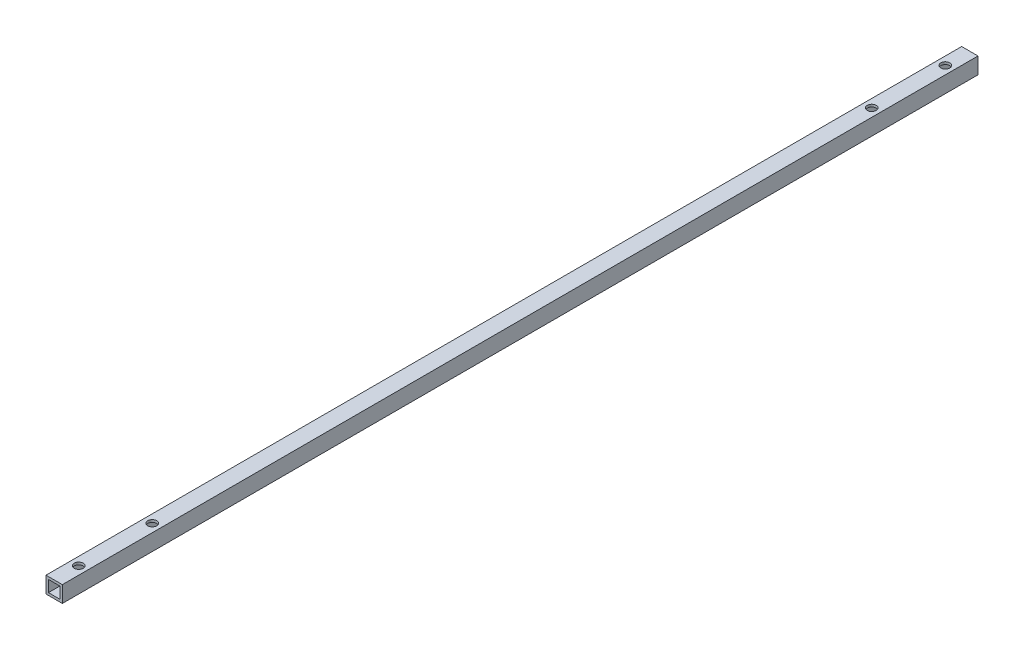
ISO-10303-21;
HEADER;
FILE_DESCRIPTION(('STEP AP214'),'2;1');
FILE_NAME('part.step','',(''),(''),'','','');
FILE_SCHEMA(('AUTOMOTIVE_DESIGN { 1 0 10303 214 1 1 1 1 }'));
ENDSEC;
DATA;
#1=APPLICATION_CONTEXT('core data for automotive mechanical design processes');
#2=APPLICATION_PROTOCOL_DEFINITION('international standard','automotive_design',2000,#1);
#3=PRODUCT_CONTEXT('',#1,'mechanical');
#4=PRODUCT('Part','Part','',(#3));
#5=PRODUCT_RELATED_PRODUCT_CATEGORY('part','',(#4));
#6=PRODUCT_DEFINITION_FORMATION('','',#4);
#7=PRODUCT_DEFINITION_CONTEXT('part definition',#1,'design');
#8=PRODUCT_DEFINITION('design','',#6,#7);
#9=PRODUCT_DEFINITION_SHAPE('','',#8);
#10=(LENGTH_UNIT() NAMED_UNIT(*) SI_UNIT(.MILLI.,.METRE.));
#11=(NAMED_UNIT(*) PLANE_ANGLE_UNIT() SI_UNIT($,.RADIAN.));
#12=(NAMED_UNIT(*) SI_UNIT($,.STERADIAN.) SOLID_ANGLE_UNIT());
#13=UNCERTAINTY_MEASURE_WITH_UNIT(LENGTH_MEASURE(1.E-05),#10,'distance_accuracy_value','');
#14=(GEOMETRIC_REPRESENTATION_CONTEXT(3) GLOBAL_UNCERTAINTY_ASSIGNED_CONTEXT((#13)) GLOBAL_UNIT_ASSIGNED_CONTEXT((#10,
#11,#12)) REPRESENTATION_CONTEXT('',''));
#15=CARTESIAN_POINT('',(0.,0.,0.));
#16=DIRECTION('',(0.,0.,1.));
#17=DIRECTION('',(1.,0.,0.));
#18=AXIS2_PLACEMENT_3D('',#15,#16,#17);
#19=CARTESIAN_POINT('',(-5.,-5.,-280.));
#20=DIRECTION('',(-1.,0.,0.));
#21=DIRECTION('',(0.,0.,1.));
#22=AXIS2_PLACEMENT_3D('',#19,#20,#21);
#23=PLANE('',#22);
#24=DIRECTION('',(0.,-1.,0.));
#25=VECTOR('',#24,1.);
#26=CARTESIAN_POINT('',(-5.,-5.,280.));
#27=LINE('',#26,#25);
#28=CARTESIAN_POINT('',(-5.,5.,280.));
#29=VERTEX_POINT('',#28);
#30=CARTESIAN_POINT('',(-5.,-5.,280.));
#31=VERTEX_POINT('',#30);
#32=EDGE_CURVE('E133',#29,#31,#27,.T.);
#33=ORIENTED_EDGE('',*,*,#32,.F.);
#34=DIRECTION('',(0.,0.,1.));
#35=VECTOR('',#34,1.);
#36=CARTESIAN_POINT('',(-5.,5.,-280.));
#37=LINE('',#36,#35);
#38=CARTESIAN_POINT('',(-5.,5.,-280.));
#39=VERTEX_POINT('',#38);
#40=EDGE_CURVE('E11',#39,#29,#37,.T.);
#41=ORIENTED_EDGE('',*,*,#40,.F.);
#42=DIRECTION('',(0.,-1.,0.));
#43=VECTOR('',#42,1.);
#44=CARTESIAN_POINT('',(-5.,-5.,-280.));
#45=LINE('',#44,#43);
#46=CARTESIAN_POINT('',(-5.,-5.,-280.));
#47=VERTEX_POINT('',#46);
#48=EDGE_CURVE('E137',#39,#47,#45,.T.);
#49=ORIENTED_EDGE('',*,*,#48,.T.);
#50=DIRECTION('',(0.,0.,1.));
#51=VECTOR('',#50,1.);
#52=CARTESIAN_POINT('',(-5.,-5.,-280.));
#53=LINE('',#52,#51);
#54=EDGE_CURVE('E150',#47,#31,#53,.T.);
#55=ORIENTED_EDGE('',*,*,#54,.T.);
#56=EDGE_LOOP('',(#33,#41,#49,#55));
#57=FACE_BOUND('',#56,.T.);
#58=ADVANCED_FACE('F32',(#57),#23,.T.);
#59=CARTESIAN_POINT('',(5.,5.,-280.));
#60=DIRECTION('',(0.,1.,0.));
#61=DIRECTION('',(0.,0.,1.));
#62=AXIS2_PLACEMENT_3D('',#59,#60,#61);
#63=PLANE('',#62);
#64=CARTESIAN_POINT('',(0.,5.,-220.));
#65=DIRECTION('',(0.,1.,0.));
#66=DIRECTION('',(0.,0.,1.));
#67=AXIS2_PLACEMENT_3D('',#64,#65,#66);
#68=CIRCLE('',#67,2.75);
#69=CARTESIAN_POINT('',(0.,5.,-217.25));
#70=VERTEX_POINT('',#69);
#71=EDGE_CURVE('E177',#70,#70,#68,.T.);
#72=ORIENTED_EDGE('',*,*,#71,.F.);
#73=EDGE_LOOP('',(#72));
#74=FACE_BOUND('',#73,.T.);
#75=CARTESIAN_POINT('',(0.,5.,220.));
#76=DIRECTION('',(0.,1.,0.));
#77=DIRECTION('',(0.,0.,1.));
#78=AXIS2_PLACEMENT_3D('',#75,#76,#77);
#79=CIRCLE('',#78,2.75);
#80=CARTESIAN_POINT('',(0.,5.,222.75));
#81=VERTEX_POINT('',#80);
#82=EDGE_CURVE('E173',#81,#81,#79,.T.);
#83=ORIENTED_EDGE('',*,*,#82,.F.);
#84=EDGE_LOOP('',(#83));
#85=FACE_BOUND('',#84,.T.);
#86=CARTESIAN_POINT('',(0.,5.,-265.));
#87=DIRECTION('',(0.,1.,0.));
#88=DIRECTION('',(0.,0.,1.));
#89=AXIS2_PLACEMENT_3D('',#86,#87,#88);
#90=CIRCLE('',#89,2.75);
#91=CARTESIAN_POINT('',(0.,5.,-262.25));
#92=VERTEX_POINT('',#91);
#93=EDGE_CURVE('E169',#92,#92,#90,.T.);
#94=ORIENTED_EDGE('',*,*,#93,.F.);
#95=EDGE_LOOP('',(#94));
#96=FACE_BOUND('',#95,.T.);
#97=CARTESIAN_POINT('',(0.,5.,265.));
#98=DIRECTION('',(0.,1.,0.));
#99=DIRECTION('',(0.,0.,1.));
#100=AXIS2_PLACEMENT_3D('',#97,#98,#99);
#101=CIRCLE('',#100,2.75);
#102=CARTESIAN_POINT('',(0.,5.,267.75));
#103=VERTEX_POINT('',#102);
#104=EDGE_CURVE('E121',#103,#103,#101,.T.);
#105=ORIENTED_EDGE('',*,*,#104,.F.);
#106=EDGE_LOOP('',(#105));
#107=FACE_BOUND('',#106,.T.);
#108=DIRECTION('',(-1.,0.,0.));
#109=VECTOR('',#108,1.);
#110=CARTESIAN_POINT('',(5.,5.,280.));
#111=LINE('',#110,#109);
#112=CARTESIAN_POINT('',(5.,5.,280.));
#113=VERTEX_POINT('',#112);
#114=EDGE_CURVE('E141',#113,#29,#111,.T.);
#115=ORIENTED_EDGE('',*,*,#114,.F.);
#116=DIRECTION('',(0.,0.,1.));
#117=VECTOR('',#116,1.);
#118=CARTESIAN_POINT('',(5.,5.,-280.));
#119=LINE('',#118,#117);
#120=CARTESIAN_POINT('',(5.,5.,-280.));
#121=VERTEX_POINT('',#120);
#122=EDGE_CURVE('E40',#121,#113,#119,.T.);
#123=ORIENTED_EDGE('',*,*,#122,.F.);
#124=DIRECTION('',(-1.,0.,0.));
#125=VECTOR('',#124,1.);
#126=CARTESIAN_POINT('',(5.,5.,-280.));
#127=LINE('',#126,#125);
#128=EDGE_CURVE('E147',#121,#39,#127,.T.);
#129=ORIENTED_EDGE('',*,*,#128,.T.);
#130=ORIENTED_EDGE('',*,*,#40,.T.);
#131=EDGE_LOOP('',(#115,#123,#129,#130));
#132=FACE_BOUND('',#131,.T.);
#133=ADVANCED_FACE('F215',(#74,#85,#96,#107,#132),#63,.T.);
#134=CARTESIAN_POINT('',(5.,-5.,-280.));
#135=DIRECTION('',(1.,0.,0.));
#136=DIRECTION('',(0.,0.,-1.));
#137=AXIS2_PLACEMENT_3D('',#134,#135,#136);
#138=PLANE('',#137);
#139=DIRECTION('',(0.,1.,0.));
#140=VECTOR('',#139,1.);
#141=CARTESIAN_POINT('',(5.,-5.,280.));
#142=LINE('',#141,#140);
#143=CARTESIAN_POINT('',(5.,-5.,280.));
#144=VERTEX_POINT('',#143);
#145=EDGE_CURVE('E156',#144,#113,#142,.T.);
#146=ORIENTED_EDGE('',*,*,#145,.F.);
#147=DIRECTION('',(0.,0.,1.));
#148=VECTOR('',#147,1.);
#149=CARTESIAN_POINT('',(5.,-5.,-280.));
#150=LINE('',#149,#148);
#151=CARTESIAN_POINT('',(5.,-5.,-280.));
#152=VERTEX_POINT('',#151);
#153=EDGE_CURVE('E162',#152,#144,#150,.T.);
#154=ORIENTED_EDGE('',*,*,#153,.F.);
#155=DIRECTION('',(0.,1.,0.));
#156=VECTOR('',#155,1.);
#157=CARTESIAN_POINT('',(5.,-5.,-280.));
#158=LINE('',#157,#156);
#159=EDGE_CURVE('E144',#152,#121,#158,.T.);
#160=ORIENTED_EDGE('',*,*,#159,.T.);
#161=ORIENTED_EDGE('',*,*,#122,.T.);
#162=EDGE_LOOP('',(#146,#154,#160,#161));
#163=FACE_BOUND('',#162,.T.);
#164=ADVANCED_FACE('F218',(#163),#138,.T.);
#165=CARTESIAN_POINT('',(5.,-5.,-280.));
#166=DIRECTION('',(0.,-1.,0.));
#167=DIRECTION('',(1.,0.,0.));
#168=AXIS2_PLACEMENT_3D('',#165,#166,#167);
#169=PLANE('',#168);
#170=CARTESIAN_POINT('',(0.,-5.,-220.));
#171=DIRECTION('',(0.,-1.,0.));
#172=DIRECTION('',(1.,0.,0.));
#173=AXIS2_PLACEMENT_3D('',#170,#171,#172);
#174=CIRCLE('',#173,2.75);
#175=CARTESIAN_POINT('',(2.75,-5.,-220.));
#176=VERTEX_POINT('',#175);
#177=EDGE_CURVE('E184',#176,#176,#174,.T.);
#178=ORIENTED_EDGE('',*,*,#177,.F.);
#179=EDGE_LOOP('',(#178));
#180=FACE_BOUND('',#179,.T.);
#181=CARTESIAN_POINT('',(0.,-5.,220.));
#182=DIRECTION('',(0.,-1.,0.));
#183=DIRECTION('',(1.,0.,0.));
#184=AXIS2_PLACEMENT_3D('',#181,#182,#183);
#185=CIRCLE('',#184,2.75);
#186=CARTESIAN_POINT('',(2.75,-5.,220.));
#187=VERTEX_POINT('',#186);
#188=EDGE_CURVE('E181',#187,#187,#185,.T.);
#189=ORIENTED_EDGE('',*,*,#188,.F.);
#190=EDGE_LOOP('',(#189));
#191=FACE_BOUND('',#190,.T.);
#192=CARTESIAN_POINT('',(0.,-5.,-265.));
#193=DIRECTION('',(0.,-1.,0.));
#194=DIRECTION('',(1.,0.,0.));
#195=AXIS2_PLACEMENT_3D('',#192,#193,#194);
#196=CIRCLE('',#195,2.75);
#197=CARTESIAN_POINT('',(2.75,-5.,-265.));
#198=VERTEX_POINT('',#197);
#199=EDGE_CURVE('E199',#198,#198,#196,.T.);
#200=ORIENTED_EDGE('',*,*,#199,.F.);
#201=EDGE_LOOP('',(#200));
#202=FACE_BOUND('',#201,.T.);
#203=CARTESIAN_POINT('',(0.,-5.,265.));
#204=DIRECTION('',(0.,-1.,0.));
#205=DIRECTION('',(1.,0.,0.));
#206=AXIS2_PLACEMENT_3D('',#203,#204,#205);
#207=CIRCLE('',#206,2.75);
#208=CARTESIAN_POINT('',(2.75,-5.,265.));
#209=VERTEX_POINT('',#208);
#210=EDGE_CURVE('E205',#209,#209,#207,.T.);
#211=ORIENTED_EDGE('',*,*,#210,.F.);
#212=EDGE_LOOP('',(#211));
#213=FACE_BOUND('',#212,.T.);
#214=DIRECTION('',(1.,0.,0.));
#215=VECTOR('',#214,1.);
#216=CARTESIAN_POINT('',(5.,-5.,280.));
#217=LINE('',#216,#215);
#218=EDGE_CURVE('E153',#31,#144,#217,.T.);
#219=ORIENTED_EDGE('',*,*,#218,.F.);
#220=ORIENTED_EDGE('',*,*,#54,.F.);
#221=DIRECTION('',(1.,0.,0.));
#222=VECTOR('',#221,1.);
#223=CARTESIAN_POINT('',(5.,-5.,-280.));
#224=LINE('',#223,#222);
#225=EDGE_CURVE('E140',#47,#152,#224,.T.);
#226=ORIENTED_EDGE('',*,*,#225,.T.);
#227=ORIENTED_EDGE('',*,*,#153,.T.);
#228=EDGE_LOOP('',(#219,#220,#226,#227));
#229=FACE_BOUND('',#228,.T.);
#230=ADVANCED_FACE('F234',(#180,#191,#202,#213,#229),#169,.T.);
#231=CARTESIAN_POINT('',(-5.,5.,-280.));
#232=DIRECTION('',(0.,0.,1.));
#233=DIRECTION('',(1.,0.,0.));
#234=AXIS2_PLACEMENT_3D('',#231,#232,#233);
#235=PLANE('',#234);
#236=DIRECTION('',(-1.,0.,0.));
#237=VECTOR('',#236,1.);
#238=CARTESIAN_POINT('',(3.5,3.5,-280.));
#239=LINE('',#238,#237);
#240=CARTESIAN_POINT('',(3.5,3.5,-280.));
#241=VERTEX_POINT('',#240);
#242=CARTESIAN_POINT('',(-3.5,3.5,-280.));
#243=VERTEX_POINT('',#242);
#244=EDGE_CURVE('E105',#241,#243,#239,.T.);
#245=ORIENTED_EDGE('',*,*,#244,.T.);
#246=DIRECTION('',(0.,-1.,0.));
#247=VECTOR('',#246,1.);
#248=CARTESIAN_POINT('',(-3.5,-3.5,-280.));
#249=LINE('',#248,#247);
#250=CARTESIAN_POINT('',(-3.5,-3.5,-280.));
#251=VERTEX_POINT('',#250);
#252=EDGE_CURVE('E99',#243,#251,#249,.T.);
#253=ORIENTED_EDGE('',*,*,#252,.T.);
#254=DIRECTION('',(1.,0.,0.));
#255=VECTOR('',#254,1.);
#256=CARTESIAN_POINT('',(3.5,-3.5,-280.));
#257=LINE('',#256,#255);
#258=CARTESIAN_POINT('',(3.5,-3.5,-280.));
#259=VERTEX_POINT('',#258);
#260=EDGE_CURVE('E108',#251,#259,#257,.T.);
#261=ORIENTED_EDGE('',*,*,#260,.T.);
#262=DIRECTION('',(0.,1.,0.));
#263=VECTOR('',#262,1.);
#264=CARTESIAN_POINT('',(3.5,-3.5,-280.));
#265=LINE('',#264,#263);
#266=EDGE_CURVE('E48',#259,#241,#265,.T.);
#267=ORIENTED_EDGE('',*,*,#266,.T.);
#268=EDGE_LOOP('',(#245,#253,#261,#267));
#269=FACE_BOUND('',#268,.T.);
#270=ORIENTED_EDGE('',*,*,#48,.F.);
#271=ORIENTED_EDGE('',*,*,#128,.F.);
#272=ORIENTED_EDGE('',*,*,#159,.F.);
#273=ORIENTED_EDGE('',*,*,#225,.F.);
#274=EDGE_LOOP('',(#270,#271,#272,#273));
#275=FACE_BOUND('',#274,.T.);
#276=ADVANCED_FACE('F112',(#269,#275),#235,.F.);
#277=CARTESIAN_POINT('',(-5.,5.,280.));
#278=DIRECTION('',(0.,0.,1.));
#279=DIRECTION('',(1.,0.,0.));
#280=AXIS2_PLACEMENT_3D('',#277,#278,#279);
#281=PLANE('',#280);
#282=DIRECTION('',(0.,-1.,0.));
#283=VECTOR('',#282,1.);
#284=CARTESIAN_POINT('',(-3.5,-3.5,280.));
#285=LINE('',#284,#283);
#286=CARTESIAN_POINT('',(-3.5,3.5,280.));
#287=VERTEX_POINT('',#286);
#288=CARTESIAN_POINT('',(-3.5,-3.5,280.));
#289=VERTEX_POINT('',#288);
#290=EDGE_CURVE('E56',#287,#289,#285,.T.);
#291=ORIENTED_EDGE('',*,*,#290,.F.);
#292=DIRECTION('',(-1.,0.,0.));
#293=VECTOR('',#292,1.);
#294=CARTESIAN_POINT('',(3.5,3.5,280.));
#295=LINE('',#294,#293);
#296=CARTESIAN_POINT('',(3.5,3.5,280.));
#297=VERTEX_POINT('',#296);
#298=EDGE_CURVE('E115',#297,#287,#295,.T.);
#299=ORIENTED_EDGE('',*,*,#298,.F.);
#300=DIRECTION('',(0.,1.,0.));
#301=VECTOR('',#300,1.);
#302=CARTESIAN_POINT('',(3.5,-3.5,280.));
#303=LINE('',#302,#301);
#304=CARTESIAN_POINT('',(3.5,-3.5,280.));
#305=VERTEX_POINT('',#304);
#306=EDGE_CURVE('E118',#305,#297,#303,.T.);
#307=ORIENTED_EDGE('',*,*,#306,.F.);
#308=DIRECTION('',(1.,0.,0.));
#309=VECTOR('',#308,1.);
#310=CARTESIAN_POINT('',(3.5,-3.5,280.));
#311=LINE('',#310,#309);
#312=EDGE_CURVE('E127',#289,#305,#311,.T.);
#313=ORIENTED_EDGE('',*,*,#312,.F.);
#314=EDGE_LOOP('',(#291,#299,#307,#313));
#315=FACE_BOUND('',#314,.T.);
#316=ORIENTED_EDGE('',*,*,#32,.T.);
#317=ORIENTED_EDGE('',*,*,#218,.T.);
#318=ORIENTED_EDGE('',*,*,#145,.T.);
#319=ORIENTED_EDGE('',*,*,#114,.T.);
#320=EDGE_LOOP('',(#316,#317,#318,#319));
#321=FACE_BOUND('',#320,.T.);
#322=ADVANCED_FACE('F224',(#315,#321),#281,.T.);
#323=CARTESIAN_POINT('',(-3.5,-3.5,-280.));
#324=DIRECTION('',(-1.,0.,0.));
#325=DIRECTION('',(0.,0.,1.));
#326=AXIS2_PLACEMENT_3D('',#323,#324,#325);
#327=PLANE('',#326);
#328=ORIENTED_EDGE('',*,*,#290,.T.);
#329=DIRECTION('',(0.,0.,1.));
#330=VECTOR('',#329,1.);
#331=CARTESIAN_POINT('',(-3.5,-3.5,-280.));
#332=LINE('',#331,#330);
#333=EDGE_CURVE('E95',#251,#289,#332,.T.);
#334=ORIENTED_EDGE('',*,*,#333,.F.);
#335=ORIENTED_EDGE('',*,*,#252,.F.);
#336=DIRECTION('',(0.,0.,1.));
#337=VECTOR('',#336,1.);
#338=CARTESIAN_POINT('',(-3.5,3.5,-280.));
#339=LINE('',#338,#337);
#340=EDGE_CURVE('E131',#243,#287,#339,.T.);
#341=ORIENTED_EDGE('',*,*,#340,.T.);
#342=EDGE_LOOP('',(#328,#334,#335,#341));
#343=FACE_BOUND('',#342,.T.);
#344=ADVANCED_FACE('F97',(#343),#327,.F.);
#345=CARTESIAN_POINT('',(3.5,3.5,-280.));
#346=DIRECTION('',(0.,1.,0.));
#347=DIRECTION('',(0.,0.,1.));
#348=AXIS2_PLACEMENT_3D('',#345,#346,#347);
#349=PLANE('',#348);
#350=CARTESIAN_POINT('',(0.,3.5,-220.));
#351=DIRECTION('',(0.,1.,0.));
#352=DIRECTION('',(0.,0.,1.));
#353=AXIS2_PLACEMENT_3D('',#350,#351,#352);
#354=CIRCLE('',#353,2.75);
#355=CARTESIAN_POINT('',(0.,3.5,-217.25));
#356=VERTEX_POINT('',#355);
#357=EDGE_CURVE('E189',#356,#356,#354,.T.);
#358=ORIENTED_EDGE('',*,*,#357,.T.);
#359=EDGE_LOOP('',(#358));
#360=FACE_BOUND('',#359,.T.);
#361=CARTESIAN_POINT('',(0.,3.5,220.));
#362=DIRECTION('',(0.,1.,0.));
#363=DIRECTION('',(0.,0.,1.));
#364=AXIS2_PLACEMENT_3D('',#361,#362,#363);
#365=CIRCLE('',#364,2.75);
#366=CARTESIAN_POINT('',(0.,3.5,222.75));
#367=VERTEX_POINT('',#366);
#368=EDGE_CURVE('E176',#367,#367,#365,.T.);
#369=ORIENTED_EDGE('',*,*,#368,.T.);
#370=EDGE_LOOP('',(#369));
#371=FACE_BOUND('',#370,.T.);
#372=CARTESIAN_POINT('',(0.,3.5,-265.));
#373=DIRECTION('',(0.,1.,0.));
#374=DIRECTION('',(0.,0.,1.));
#375=AXIS2_PLACEMENT_3D('',#372,#373,#374);
#376=CIRCLE('',#375,2.75);
#377=CARTESIAN_POINT('',(0.,3.5,-262.25));
#378=VERTEX_POINT('',#377);
#379=EDGE_CURVE('E172',#378,#378,#376,.T.);
#380=ORIENTED_EDGE('',*,*,#379,.T.);
#381=EDGE_LOOP('',(#380));
#382=FACE_BOUND('',#381,.T.);
#383=CARTESIAN_POINT('',(0.,3.5,265.));
#384=DIRECTION('',(0.,1.,0.));
#385=DIRECTION('',(0.,0.,1.));
#386=AXIS2_PLACEMENT_3D('',#383,#384,#385);
#387=CIRCLE('',#386,2.75);
#388=CARTESIAN_POINT('',(0.,3.5,267.75));
#389=VERTEX_POINT('',#388);
#390=EDGE_CURVE('E168',#389,#389,#387,.T.);
#391=ORIENTED_EDGE('',*,*,#390,.T.);
#392=EDGE_LOOP('',(#391));
#393=FACE_BOUND('',#392,.T.);
#394=ORIENTED_EDGE('',*,*,#298,.T.);
#395=ORIENTED_EDGE('',*,*,#340,.F.);
#396=ORIENTED_EDGE('',*,*,#244,.F.);
#397=DIRECTION('',(0.,0.,1.));
#398=VECTOR('',#397,1.);
#399=CARTESIAN_POINT('',(3.5,3.5,-280.));
#400=LINE('',#399,#398);
#401=EDGE_CURVE('E134',#241,#297,#400,.T.);
#402=ORIENTED_EDGE('',*,*,#401,.T.);
#403=EDGE_LOOP('',(#394,#395,#396,#402));
#404=FACE_BOUND('',#403,.T.);
#405=ADVANCED_FACE('F281',(#360,#371,#382,#393,#404),#349,.F.);
#406=CARTESIAN_POINT('',(3.5,-3.5,-280.));
#407=DIRECTION('',(1.,0.,0.));
#408=DIRECTION('',(0.,0.,-1.));
#409=AXIS2_PLACEMENT_3D('',#406,#407,#408);
#410=PLANE('',#409);
#411=ORIENTED_EDGE('',*,*,#306,.T.);
#412=ORIENTED_EDGE('',*,*,#401,.F.);
#413=ORIENTED_EDGE('',*,*,#266,.F.);
#414=DIRECTION('',(0.,0.,1.));
#415=VECTOR('',#414,1.);
#416=CARTESIAN_POINT('',(3.5,-3.5,-280.));
#417=LINE('',#416,#415);
#418=EDGE_CURVE('E104',#259,#305,#417,.T.);
#419=ORIENTED_EDGE('',*,*,#418,.T.);
#420=EDGE_LOOP('',(#411,#412,#413,#419));
#421=FACE_BOUND('',#420,.T.);
#422=ADVANCED_FACE('F288',(#421),#410,.F.);
#423=CARTESIAN_POINT('',(3.5,-3.5,-280.));
#424=DIRECTION('',(0.,-1.,0.));
#425=DIRECTION('',(0.,0.,-1.));
#426=AXIS2_PLACEMENT_3D('',#423,#424,#425);
#427=PLANE('',#426);
#428=CARTESIAN_POINT('',(0.,-3.5,-220.));
#429=DIRECTION('',(0.,-1.,0.));
#430=DIRECTION('',(0.,0.,-1.));
#431=AXIS2_PLACEMENT_3D('',#428,#429,#430);
#432=CIRCLE('',#431,2.75);
#433=CARTESIAN_POINT('',(0.,-3.5,-222.75));
#434=VERTEX_POINT('',#433);
#435=EDGE_CURVE('E35',#434,#434,#432,.T.);
#436=ORIENTED_EDGE('',*,*,#435,.T.);
#437=EDGE_LOOP('',(#436));
#438=FACE_BOUND('',#437,.T.);
#439=CARTESIAN_POINT('',(0.,-3.5,220.));
#440=DIRECTION('',(0.,-1.,0.));
#441=DIRECTION('',(0.,0.,-1.));
#442=AXIS2_PLACEMENT_3D('',#439,#440,#441);
#443=CIRCLE('',#442,2.75);
#444=CARTESIAN_POINT('',(0.,-3.5,217.25));
#445=VERTEX_POINT('',#444);
#446=EDGE_CURVE('E174',#445,#445,#443,.T.);
#447=ORIENTED_EDGE('',*,*,#446,.T.);
#448=EDGE_LOOP('',(#447));
#449=FACE_BOUND('',#448,.T.);
#450=CARTESIAN_POINT('',(0.,-3.5,-265.));
#451=DIRECTION('',(0.,-1.,0.));
#452=DIRECTION('',(0.,0.,-1.));
#453=AXIS2_PLACEMENT_3D('',#450,#451,#452);
#454=CIRCLE('',#453,2.75);
#455=CARTESIAN_POINT('',(0.,-3.5,-267.75));
#456=VERTEX_POINT('',#455);
#457=EDGE_CURVE('E170',#456,#456,#454,.T.);
#458=ORIENTED_EDGE('',*,*,#457,.T.);
#459=EDGE_LOOP('',(#458));
#460=FACE_BOUND('',#459,.T.);
#461=CARTESIAN_POINT('',(0.,-3.5,265.));
#462=DIRECTION('',(0.,-1.,0.));
#463=DIRECTION('',(0.,0.,-1.));
#464=AXIS2_PLACEMENT_3D('',#461,#462,#463);
#465=CIRCLE('',#464,2.75);
#466=CARTESIAN_POINT('',(0.,-3.5,262.25));
#467=VERTEX_POINT('',#466);
#468=EDGE_CURVE('E165',#467,#467,#465,.T.);
#469=ORIENTED_EDGE('',*,*,#468,.T.);
#470=EDGE_LOOP('',(#469));
#471=FACE_BOUND('',#470,.T.);
#472=ORIENTED_EDGE('',*,*,#312,.T.);
#473=ORIENTED_EDGE('',*,*,#418,.F.);
#474=ORIENTED_EDGE('',*,*,#260,.F.);
#475=ORIENTED_EDGE('',*,*,#333,.T.);
#476=EDGE_LOOP('',(#472,#473,#474,#475));
#477=FACE_BOUND('',#476,.T.);
#478=ADVANCED_FACE('F109',(#438,#449,#460,#471,#477),#427,.F.);
#479=CARTESIAN_POINT('',(0.,-15.,265.));
#480=DIRECTION('',(0.,1.,0.));
#481=DIRECTION('',(0.,0.,1.));
#482=AXIS2_PLACEMENT_3D('',#479,#480,#481);
#483=CYLINDRICAL_SURFACE('',#482,2.75);
#484=ORIENTED_EDGE('',*,*,#210,.T.);
#485=EDGE_LOOP('',(#484));
#486=FACE_BOUND('',#485,.T.);
#487=ORIENTED_EDGE('',*,*,#468,.F.);
#488=EDGE_LOOP('',(#487));
#489=FACE_BOUND('',#488,.T.);
#490=ADVANCED_FACE('F303',(#486,#489),#483,.F.);
#491=ORIENTED_EDGE('',*,*,#104,.T.);
#492=EDGE_LOOP('',(#491));
#493=FACE_BOUND('',#492,.T.);
#494=ORIENTED_EDGE('',*,*,#390,.F.);
#495=EDGE_LOOP('',(#494));
#496=FACE_BOUND('',#495,.T.);
#497=ADVANCED_FACE('F212',(#493,#496),#483,.F.);
#498=CARTESIAN_POINT('',(0.,-15.,-265.));
#499=DIRECTION('',(0.,1.,0.));
#500=DIRECTION('',(0.,0.,1.));
#501=AXIS2_PLACEMENT_3D('',#498,#499,#500);
#502=CYLINDRICAL_SURFACE('',#501,2.75);
#503=ORIENTED_EDGE('',*,*,#199,.T.);
#504=EDGE_LOOP('',(#503));
#505=FACE_BOUND('',#504,.T.);
#506=ORIENTED_EDGE('',*,*,#457,.F.);
#507=EDGE_LOOP('',(#506));
#508=FACE_BOUND('',#507,.T.);
#509=ADVANCED_FACE('F316',(#505,#508),#502,.F.);
#510=ORIENTED_EDGE('',*,*,#93,.T.);
#511=EDGE_LOOP('',(#510));
#512=FACE_BOUND('',#511,.T.);
#513=ORIENTED_EDGE('',*,*,#379,.F.);
#514=EDGE_LOOP('',(#513));
#515=FACE_BOUND('',#514,.T.);
#516=ADVANCED_FACE('F322',(#512,#515),#502,.F.);
#517=CARTESIAN_POINT('',(0.,-15.,220.));
#518=DIRECTION('',(0.,1.,0.));
#519=DIRECTION('',(0.,0.,1.));
#520=AXIS2_PLACEMENT_3D('',#517,#518,#519);
#521=CYLINDRICAL_SURFACE('',#520,2.75);
#522=ORIENTED_EDGE('',*,*,#188,.T.);
#523=EDGE_LOOP('',(#522));
#524=FACE_BOUND('',#523,.T.);
#525=ORIENTED_EDGE('',*,*,#446,.F.);
#526=EDGE_LOOP('',(#525));
#527=FACE_BOUND('',#526,.T.);
#528=ADVANCED_FACE('F330',(#524,#527),#521,.F.);
#529=ORIENTED_EDGE('',*,*,#82,.T.);
#530=EDGE_LOOP('',(#529));
#531=FACE_BOUND('',#530,.T.);
#532=ORIENTED_EDGE('',*,*,#368,.F.);
#533=EDGE_LOOP('',(#532));
#534=FACE_BOUND('',#533,.T.);
#535=ADVANCED_FACE('F337',(#531,#534),#521,.F.);
#536=CARTESIAN_POINT('',(0.,-15.,-220.));
#537=DIRECTION('',(0.,1.,0.));
#538=DIRECTION('',(0.,0.,1.));
#539=AXIS2_PLACEMENT_3D('',#536,#537,#538);
#540=CYLINDRICAL_SURFACE('',#539,2.75);
#541=ORIENTED_EDGE('',*,*,#177,.T.);
#542=EDGE_LOOP('',(#541));
#543=FACE_BOUND('',#542,.T.);
#544=ORIENTED_EDGE('',*,*,#435,.F.);
#545=EDGE_LOOP('',(#544));
#546=FACE_BOUND('',#545,.T.);
#547=ADVANCED_FACE('F345',(#543,#546),#540,.F.);
#548=ORIENTED_EDGE('',*,*,#71,.T.);
#549=EDGE_LOOP('',(#548));
#550=FACE_BOUND('',#549,.T.);
#551=ORIENTED_EDGE('',*,*,#357,.F.);
#552=EDGE_LOOP('',(#551));
#553=FACE_BOUND('',#552,.T.);
#554=ADVANCED_FACE('F352',(#550,#553),#540,.F.);
#555=CLOSED_SHELL('',(#58,#133,#164,#230,#276,#322,#344,#405,#422,#478,#490,#497,#509,#516,#528,
#535,#547,#554));
#556=MANIFOLD_SOLID_BREP('B2',#555);
#557=ADVANCED_BREP_SHAPE_REPRESENTATION('',(#18,#556),#14);
#558=SHAPE_DEFINITION_REPRESENTATION(#9,#557);
ENDSEC;
END-ISO-10303-21;
